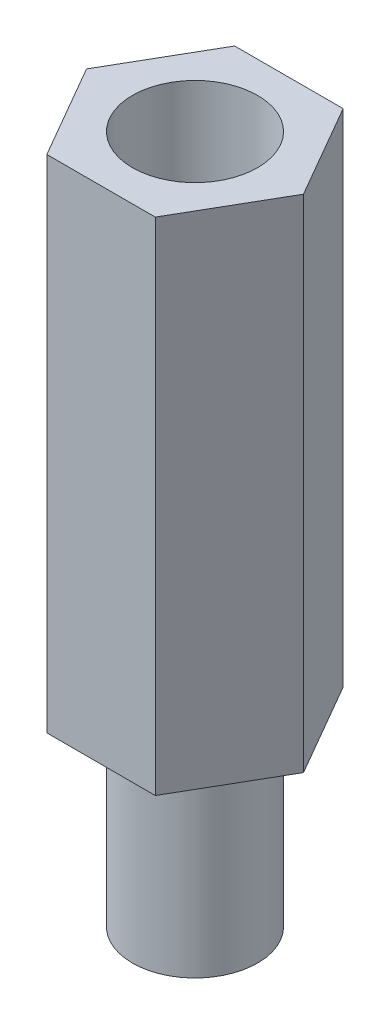
ISO-10303-21;
HEADER;
FILE_DESCRIPTION(('STEP AP214'),'2;1');
FILE_NAME('part.step','',(''),(''),'','','');
FILE_SCHEMA(('AUTOMOTIVE_DESIGN { 1 0 10303 214 1 1 1 1 }'));
ENDSEC;
DATA;
#1=APPLICATION_CONTEXT('core data for automotive mechanical design processes');
#2=APPLICATION_PROTOCOL_DEFINITION('international standard','automotive_design',2000,#1);
#3=PRODUCT_CONTEXT('',#1,'mechanical');
#4=PRODUCT('Part','Part','',(#3));
#5=PRODUCT_RELATED_PRODUCT_CATEGORY('part','',(#4));
#6=PRODUCT_DEFINITION_FORMATION('','',#4);
#7=PRODUCT_DEFINITION_CONTEXT('part definition',#1,'design');
#8=PRODUCT_DEFINITION('design','',#6,#7);
#9=PRODUCT_DEFINITION_SHAPE('','',#8);
#10=(LENGTH_UNIT() NAMED_UNIT(*) SI_UNIT(.MILLI.,.METRE.));
#11=(NAMED_UNIT(*) PLANE_ANGLE_UNIT() SI_UNIT($,.RADIAN.));
#12=(NAMED_UNIT(*) SI_UNIT($,.STERADIAN.) SOLID_ANGLE_UNIT());
#13=UNCERTAINTY_MEASURE_WITH_UNIT(LENGTH_MEASURE(1.E-05),#10,'distance_accuracy_value','');
#14=(GEOMETRIC_REPRESENTATION_CONTEXT(3) GLOBAL_UNCERTAINTY_ASSIGNED_CONTEXT((#13)) GLOBAL_UNIT_ASSIGNED_CONTEXT((#10,
#11,#12)) REPRESENTATION_CONTEXT('',''));
#15=CARTESIAN_POINT('',(0.,0.,0.));
#16=DIRECTION('',(0.,0.,1.));
#17=DIRECTION('',(1.,0.,0.));
#18=AXIS2_PLACEMENT_3D('',#15,#16,#17);
#19=CARTESIAN_POINT('',(0.,-6.,0.));
#20=DIRECTION('',(0.,1.,0.));
#21=DIRECTION('',(0.,0.,1.));
#22=AXIS2_PLACEMENT_3D('',#19,#20,#21);
#23=CYLINDRICAL_SURFACE('',#22,2.);
#24=CARTESIAN_POINT('',(0.,-6.,0.));
#25=DIRECTION('',(0.,1.,0.));
#26=DIRECTION('',(0.,0.,1.));
#27=AXIS2_PLACEMENT_3D('',#24,#25,#26);
#28=CIRCLE('',#27,2.);
#29=CARTESIAN_POINT('',(0.,-6.,2.));
#30=VERTEX_POINT('',#29);
#31=EDGE_CURVE('E11',#30,#30,#28,.T.);
#32=ORIENTED_EDGE('',*,*,#31,.T.);
#33=EDGE_LOOP('',(#32));
#34=FACE_BOUND('',#33,.T.);
#35=CARTESIAN_POINT('',(0.,0.,0.));
#36=DIRECTION('',(0.,1.,0.));
#37=DIRECTION('',(0.,0.,1.));
#38=AXIS2_PLACEMENT_3D('',#35,#36,#37);
#39=CIRCLE('',#38,2.);
#40=CARTESIAN_POINT('',(0.,0.,2.));
#41=VERTEX_POINT('',#40);
#42=EDGE_CURVE('E50',#41,#41,#39,.T.);
#43=ORIENTED_EDGE('',*,*,#42,.F.);
#44=EDGE_LOOP('',(#43));
#45=FACE_BOUND('',#44,.T.);
#46=ADVANCED_FACE('F47',(#34,#45),#23,.T.);
#47=CARTESIAN_POINT('',(0.,-6.,0.));
#48=DIRECTION('',(0.,1.,0.));
#49=DIRECTION('',(0.,0.,1.));
#50=AXIS2_PLACEMENT_3D('',#47,#48,#49);
#51=PLANE('',#50);
#52=ORIENTED_EDGE('',*,*,#31,.F.);
#53=EDGE_LOOP('',(#52));
#54=FACE_BOUND('',#53,.T.);
#55=ADVANCED_FACE('F62',(#54),#51,.F.);
#56=CARTESIAN_POINT('',(0.,0.,0.));
#57=DIRECTION('',(0.,1.,0.));
#58=DIRECTION('',(0.,0.,1.));
#59=AXIS2_PLACEMENT_3D('',#56,#57,#58);
#60=PLANE('',#59);
#61=ORIENTED_EDGE('',*,*,#42,.T.);
#62=EDGE_LOOP('',(#61));
#63=FACE_BOUND('',#62,.T.);
#64=ADVANCED_FACE('F59',(#63),#60,.T.);
#65=CLOSED_SHELL('',(#46,#55,#64));
#66=MANIFOLD_SOLID_BREP('B2',#65);
#67=CARTESIAN_POINT('',(0.,16.,0.));
#68=DIRECTION('',(0.,1.,0.));
#69=DIRECTION('',(0.,0.,1.));
#70=AXIS2_PLACEMENT_3D('',#67,#68,#69);
#71=PLANE('',#70);
#72=DIRECTION('',(0.5,0.,-0.866025403784439));
#73=VECTOR('',#72,1.);
#74=CARTESIAN_POINT('',(1.73205080756889,16.,3.));
#75=LINE('',#74,#73);
#76=CARTESIAN_POINT('',(1.73205080756889,16.,3.));
#77=VERTEX_POINT('',#76);
#78=CARTESIAN_POINT('',(3.46410161513776,16.,0.));
#79=VERTEX_POINT('',#78);
#80=EDGE_CURVE('E195',#77,#79,#75,.T.);
#81=ORIENTED_EDGE('',*,*,#80,.T.);
#82=DIRECTION('',(-0.499999999999999,0.,-0.866025403784439));
#83=VECTOR('',#82,1.);
#84=CARTESIAN_POINT('',(3.46410161513776,16.,0.));
#85=LINE('',#84,#83);
#86=CARTESIAN_POINT('',(1.73205080756888,16.,-3.));
#87=VERTEX_POINT('',#86);
#88=EDGE_CURVE('E143',#79,#87,#85,.T.);
#89=ORIENTED_EDGE('',*,*,#88,.T.);
#90=DIRECTION('',(-1.,0.,0.));
#91=VECTOR('',#90,1.);
#92=CARTESIAN_POINT('',(1.73205080756888,16.,-3.));
#93=LINE('',#92,#91);
#94=CARTESIAN_POINT('',(-1.73205080756888,16.,-3.));
#95=VERTEX_POINT('',#94);
#96=EDGE_CURVE('E156',#87,#95,#93,.T.);
#97=ORIENTED_EDGE('',*,*,#96,.T.);
#98=DIRECTION('',(-0.500000000000001,0.,0.866025403784438));
#99=VECTOR('',#98,1.);
#100=CARTESIAN_POINT('',(-1.73205080756888,16.,-3.));
#101=LINE('',#100,#99);
#102=CARTESIAN_POINT('',(-3.46410161513776,16.,0.));
#103=VERTEX_POINT('',#102);
#104=EDGE_CURVE('E150',#95,#103,#101,.T.);
#105=ORIENTED_EDGE('',*,*,#104,.T.);
#106=DIRECTION('',(0.5,0.,0.866025403784439));
#107=VECTOR('',#106,1.);
#108=CARTESIAN_POINT('',(-3.46410161513776,16.,0.));
#109=LINE('',#108,#107);
#110=CARTESIAN_POINT('',(-1.73205080756888,16.,3.));
#111=VERTEX_POINT('',#110);
#112=EDGE_CURVE('E154',#103,#111,#109,.T.);
#113=ORIENTED_EDGE('',*,*,#112,.T.);
#114=DIRECTION('',(1.,0.,0.));
#115=VECTOR('',#114,1.);
#116=CARTESIAN_POINT('',(-1.73205080756888,16.,3.));
#117=LINE('',#116,#115);
#118=EDGE_CURVE('E106',#111,#77,#117,.T.);
#119=ORIENTED_EDGE('',*,*,#118,.T.);
#120=EDGE_LOOP('',(#81,#89,#97,#105,#113,#119));
#121=FACE_BOUND('',#120,.T.);
#122=CARTESIAN_POINT('',(0.,16.,0.));
#123=DIRECTION('',(0.,1.,0.));
#124=DIRECTION('',(0.,0.,1.));
#125=AXIS2_PLACEMENT_3D('',#122,#123,#124);
#126=CIRCLE('',#125,2.);
#127=CARTESIAN_POINT('',(0.,16.,2.));
#128=VERTEX_POINT('',#127);
#129=EDGE_CURVE('E183',#128,#128,#126,.T.);
#130=ORIENTED_EDGE('',*,*,#129,.F.);
#131=EDGE_LOOP('',(#130));
#132=FACE_BOUND('',#131,.T.);
#133=ADVANCED_FACE('F88',(#121,#132),#71,.T.);
#134=CARTESIAN_POINT('',(0.,0.,0.));
#135=DIRECTION('',(0.,1.,0.));
#136=DIRECTION('',(0.,0.,1.));
#137=AXIS2_PLACEMENT_3D('',#134,#135,#136);
#138=PLANE('',#137);
#139=DIRECTION('',(0.5,0.,-0.866025403784439));
#140=VECTOR('',#139,1.);
#141=CARTESIAN_POINT('',(1.73205080756889,0.,3.));
#142=LINE('',#141,#140);
#143=CARTESIAN_POINT('',(1.73205080756889,0.,3.));
#144=VERTEX_POINT('',#143);
#145=CARTESIAN_POINT('',(3.46410161513776,0.,0.));
#146=VERTEX_POINT('',#145);
#147=EDGE_CURVE('E178',#144,#146,#142,.T.);
#148=ORIENTED_EDGE('',*,*,#147,.F.);
#149=DIRECTION('',(1.,0.,0.));
#150=VECTOR('',#149,1.);
#151=CARTESIAN_POINT('',(-1.73205080756888,0.,3.));
#152=LINE('',#151,#150);
#153=CARTESIAN_POINT('',(-1.73205080756888,0.,3.));
#154=VERTEX_POINT('',#153);
#155=EDGE_CURVE('E135',#154,#144,#152,.T.);
#156=ORIENTED_EDGE('',*,*,#155,.F.);
#157=DIRECTION('',(0.5,0.,0.866025403784439));
#158=VECTOR('',#157,1.);
#159=CARTESIAN_POINT('',(-3.46410161513776,0.,0.));
#160=LINE('',#159,#158);
#161=CARTESIAN_POINT('',(-3.46410161513776,0.,0.));
#162=VERTEX_POINT('',#161);
#163=EDGE_CURVE('E129',#162,#154,#160,.T.);
#164=ORIENTED_EDGE('',*,*,#163,.F.);
#165=DIRECTION('',(-0.500000000000001,0.,0.866025403784438));
#166=VECTOR('',#165,1.);
#167=CARTESIAN_POINT('',(-1.73205080756888,0.,-3.));
#168=LINE('',#167,#166);
#169=CARTESIAN_POINT('',(-1.73205080756888,0.,-3.));
#170=VERTEX_POINT('',#169);
#171=EDGE_CURVE('E165',#170,#162,#168,.T.);
#172=ORIENTED_EDGE('',*,*,#171,.F.);
#173=DIRECTION('',(-1.,0.,0.));
#174=VECTOR('',#173,1.);
#175=CARTESIAN_POINT('',(1.73205080756888,0.,-3.));
#176=LINE('',#175,#174);
#177=CARTESIAN_POINT('',(1.73205080756888,0.,-3.));
#178=VERTEX_POINT('',#177);
#179=EDGE_CURVE('E186',#178,#170,#176,.T.);
#180=ORIENTED_EDGE('',*,*,#179,.F.);
#181=DIRECTION('',(-0.499999999999999,0.,-0.866025403784439));
#182=VECTOR('',#181,1.);
#183=CARTESIAN_POINT('',(3.46410161513776,0.,0.));
#184=LINE('',#183,#182);
#185=EDGE_CURVE('E182',#146,#178,#184,.T.);
#186=ORIENTED_EDGE('',*,*,#185,.F.);
#187=EDGE_LOOP('',(#148,#156,#164,#172,#180,#186));
#188=FACE_BOUND('',#187,.T.);
#189=CARTESIAN_POINT('',(0.,0.,0.));
#190=DIRECTION('',(0.,1.,0.));
#191=DIRECTION('',(0.,0.,1.));
#192=AXIS2_PLACEMENT_3D('',#189,#190,#191);
#193=CIRCLE('',#192,2.);
#194=CARTESIAN_POINT('',(0.,0.,2.));
#195=VERTEX_POINT('',#194);
#196=EDGE_CURVE('E292',#195,#195,#193,.T.);
#197=ORIENTED_EDGE('',*,*,#196,.T.);
#198=EDGE_LOOP('',(#197));
#199=FACE_BOUND('',#198,.T.);
#200=ADVANCED_FACE('F208',(#188,#199),#138,.F.);
#201=CARTESIAN_POINT('',(1.73205080756889,16.,3.));
#202=DIRECTION('',(-0.866025403784439,0.,-0.5));
#203=DIRECTION('',(-0.5,0.,0.866025403784439));
#204=AXIS2_PLACEMENT_3D('',#201,#202,#203);
#205=PLANE('',#204);
#206=ORIENTED_EDGE('',*,*,#147,.T.);
#207=DIRECTION('',(0.,-1.,0.));
#208=VECTOR('',#207,1.);
#209=CARTESIAN_POINT('',(3.46410161513776,16.,0.));
#210=LINE('',#209,#208);
#211=EDGE_CURVE('E45',#79,#146,#210,.T.);
#212=ORIENTED_EDGE('',*,*,#211,.F.);
#213=ORIENTED_EDGE('',*,*,#80,.F.);
#214=DIRECTION('',(0.,-1.,0.));
#215=VECTOR('',#214,1.);
#216=CARTESIAN_POINT('',(1.73205080756889,16.,3.));
#217=LINE('',#216,#215);
#218=EDGE_CURVE('E174',#77,#144,#217,.T.);
#219=ORIENTED_EDGE('',*,*,#218,.T.);
#220=EDGE_LOOP('',(#206,#212,#213,#219));
#221=FACE_BOUND('',#220,.T.);
#222=ADVANCED_FACE('F90',(#221),#205,.F.);
#223=CARTESIAN_POINT('',(3.46410161513776,16.,0.));
#224=DIRECTION('',(-0.866025403784439,0.,0.499999999999999));
#225=DIRECTION('',(0.499999999999999,0.,0.866025403784439));
#226=AXIS2_PLACEMENT_3D('',#223,#224,#225);
#227=PLANE('',#226);
#228=ORIENTED_EDGE('',*,*,#185,.T.);
#229=DIRECTION('',(0.,-1.,0.));
#230=VECTOR('',#229,1.);
#231=CARTESIAN_POINT('',(1.73205080756888,16.,-3.));
#232=LINE('',#231,#230);
#233=EDGE_CURVE('E98',#87,#178,#232,.T.);
#234=ORIENTED_EDGE('',*,*,#233,.F.);
#235=ORIENTED_EDGE('',*,*,#88,.F.);
#236=ORIENTED_EDGE('',*,*,#211,.T.);
#237=EDGE_LOOP('',(#228,#234,#235,#236));
#238=FACE_BOUND('',#237,.T.);
#239=ADVANCED_FACE('F233',(#238),#227,.F.);
#240=CARTESIAN_POINT('',(1.73205080756888,16.,-3.));
#241=DIRECTION('',(0.,0.,1.));
#242=DIRECTION('',(1.,0.,0.));
#243=AXIS2_PLACEMENT_3D('',#240,#241,#242);
#244=PLANE('',#243);
#245=ORIENTED_EDGE('',*,*,#179,.T.);
#246=DIRECTION('',(0.,-1.,0.));
#247=VECTOR('',#246,1.);
#248=CARTESIAN_POINT('',(-1.73205080756888,16.,-3.));
#249=LINE('',#248,#247);
#250=EDGE_CURVE('E167',#95,#170,#249,.T.);
#251=ORIENTED_EDGE('',*,*,#250,.F.);
#252=ORIENTED_EDGE('',*,*,#96,.F.);
#253=ORIENTED_EDGE('',*,*,#233,.T.);
#254=EDGE_LOOP('',(#245,#251,#252,#253));
#255=FACE_BOUND('',#254,.T.);
#256=ADVANCED_FACE('F205',(#255),#244,.F.);
#257=CARTESIAN_POINT('',(-1.73205080756888,16.,-3.));
#258=DIRECTION('',(0.866025403784438,0.,0.500000000000001));
#259=DIRECTION('',(0.500000000000001,0.,-0.866025403784438));
#260=AXIS2_PLACEMENT_3D('',#257,#258,#259);
#261=PLANE('',#260);
#262=ORIENTED_EDGE('',*,*,#171,.T.);
#263=DIRECTION('',(0.,-1.,0.));
#264=VECTOR('',#263,1.);
#265=CARTESIAN_POINT('',(-3.46410161513776,16.,0.));
#266=LINE('',#265,#264);
#267=EDGE_CURVE('E162',#103,#162,#266,.T.);
#268=ORIENTED_EDGE('',*,*,#267,.F.);
#269=ORIENTED_EDGE('',*,*,#104,.F.);
#270=ORIENTED_EDGE('',*,*,#250,.T.);
#271=EDGE_LOOP('',(#262,#268,#269,#270));
#272=FACE_BOUND('',#271,.T.);
#273=ADVANCED_FACE('F163',(#272),#261,.F.);
#274=CARTESIAN_POINT('',(-3.46410161513776,16.,0.));
#275=DIRECTION('',(0.866025403784439,0.,-0.5));
#276=DIRECTION('',(-0.5,0.,-0.866025403784439));
#277=AXIS2_PLACEMENT_3D('',#274,#275,#276);
#278=PLANE('',#277);
#279=ORIENTED_EDGE('',*,*,#163,.T.);
#280=DIRECTION('',(0.,-1.,0.));
#281=VECTOR('',#280,1.);
#282=CARTESIAN_POINT('',(-1.73205080756888,16.,3.));
#283=LINE('',#282,#281);
#284=EDGE_CURVE('E168',#111,#154,#283,.T.);
#285=ORIENTED_EDGE('',*,*,#284,.F.);
#286=ORIENTED_EDGE('',*,*,#112,.F.);
#287=ORIENTED_EDGE('',*,*,#267,.T.);
#288=EDGE_LOOP('',(#279,#285,#286,#287));
#289=FACE_BOUND('',#288,.T.);
#290=ADVANCED_FACE('F170',(#289),#278,.F.);
#291=CARTESIAN_POINT('',(-1.73205080756888,16.,3.));
#292=DIRECTION('',(0.,0.,-1.));
#293=DIRECTION('',(-1.,0.,0.));
#294=AXIS2_PLACEMENT_3D('',#291,#292,#293);
#295=PLANE('',#294);
#296=ORIENTED_EDGE('',*,*,#155,.T.);
#297=ORIENTED_EDGE('',*,*,#218,.F.);
#298=ORIENTED_EDGE('',*,*,#118,.F.);
#299=ORIENTED_EDGE('',*,*,#284,.T.);
#300=EDGE_LOOP('',(#296,#297,#298,#299));
#301=FACE_BOUND('',#300,.T.);
#302=ADVANCED_FACE('F213',(#301),#295,.F.);
#303=CARTESIAN_POINT('',(0.,16.,0.));
#304=DIRECTION('',(0.,-1.,0.));
#305=DIRECTION('',(0.,0.,-1.));
#306=AXIS2_PLACEMENT_3D('',#303,#304,#305);
#307=CYLINDRICAL_SURFACE('',#306,2.);
#308=ORIENTED_EDGE('',*,*,#129,.T.);
#309=EDGE_LOOP('',(#308));
#310=FACE_BOUND('',#309,.T.);
#311=ORIENTED_EDGE('',*,*,#196,.F.);
#312=EDGE_LOOP('',(#311));
#313=FACE_BOUND('',#312,.T.);
#314=ADVANCED_FACE('F215',(#310,#313),#307,.F.);
#315=CLOSED_SHELL('',(#133,#200,#222,#239,#256,#273,#290,#302,#314));
#316=MANIFOLD_SOLID_BREP('B6',#315);
#317=ADVANCED_BREP_SHAPE_REPRESENTATION('',(#18,#66,#316),#14);
#318=SHAPE_DEFINITION_REPRESENTATION(#9,#317);
ENDSEC;
END-ISO-10303-21;
